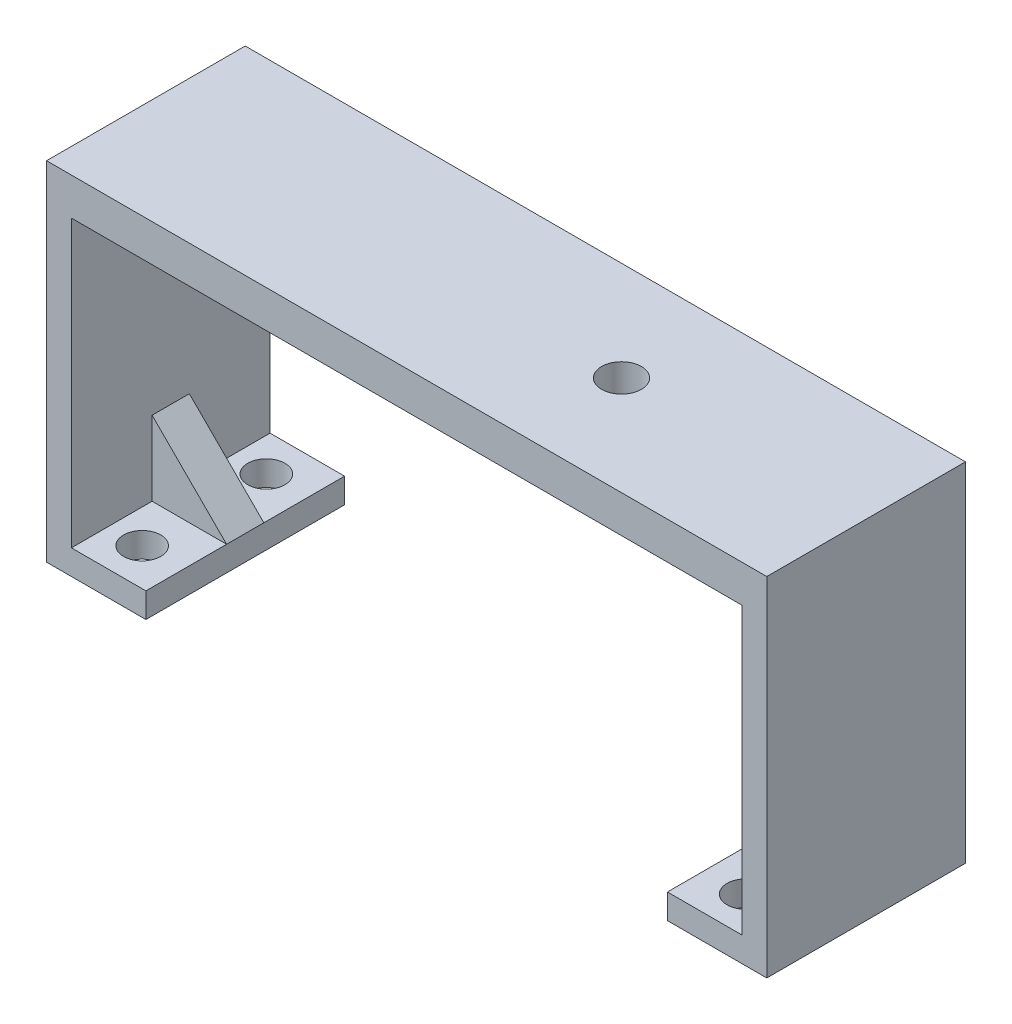
ISO-10303-21;
HEADER;
FILE_DESCRIPTION(('STEP AP214'),'2;1');
FILE_NAME('part.step','',(''),(''),'','','');
FILE_SCHEMA(('AUTOMOTIVE_DESIGN { 1 0 10303 214 1 1 1 1 }'));
ENDSEC;
DATA;
#1=APPLICATION_CONTEXT('core data for automotive mechanical design processes');
#2=APPLICATION_PROTOCOL_DEFINITION('international standard','automotive_design',2000,#1);
#3=PRODUCT_CONTEXT('',#1,'mechanical');
#4=PRODUCT('Part','Part','',(#3));
#5=PRODUCT_RELATED_PRODUCT_CATEGORY('part','',(#4));
#6=PRODUCT_DEFINITION_FORMATION('','',#4);
#7=PRODUCT_DEFINITION_CONTEXT('part definition',#1,'design');
#8=PRODUCT_DEFINITION('design','',#6,#7);
#9=PRODUCT_DEFINITION_SHAPE('','',#8);
#10=(LENGTH_UNIT() NAMED_UNIT(*) SI_UNIT(.MILLI.,.METRE.));
#11=(NAMED_UNIT(*) PLANE_ANGLE_UNIT() SI_UNIT($,.RADIAN.));
#12=(NAMED_UNIT(*) SI_UNIT($,.STERADIAN.) SOLID_ANGLE_UNIT());
#13=UNCERTAINTY_MEASURE_WITH_UNIT(LENGTH_MEASURE(1.E-05),#10,'distance_accuracy_value','');
#14=(GEOMETRIC_REPRESENTATION_CONTEXT(3) GLOBAL_UNCERTAINTY_ASSIGNED_CONTEXT((#13)) GLOBAL_UNIT_ASSIGNED_CONTEXT((#10,
#11,#12)) REPRESENTATION_CONTEXT('',''));
#15=CARTESIAN_POINT('',(0.,0.,0.));
#16=DIRECTION('',(0.,0.,1.));
#17=DIRECTION('',(1.,0.,0.));
#18=AXIS2_PLACEMENT_3D('',#15,#16,#17);
#19=CARTESIAN_POINT('',(27.,2.,8.));
#20=DIRECTION('',(0.,-1.,0.));
#21=DIRECTION('',(0.,0.,-1.));
#22=AXIS2_PLACEMENT_3D('',#19,#20,#21);
#23=PLANE('',#22);
#24=CARTESIAN_POINT('',(24.3,2.,-5.));
#25=DIRECTION('',(0.,-1.,0.));
#26=DIRECTION('',(0.,0.,-1.));
#27=AXIS2_PLACEMENT_3D('',#24,#25,#26);
#28=CIRCLE('',#27,1.5);
#29=CARTESIAN_POINT('',(24.3,2.,-6.5));
#30=VERTEX_POINT('',#29);
#31=EDGE_CURVE('E365',#30,#30,#28,.T.);
#32=ORIENTED_EDGE('',*,*,#31,.T.);
#33=EDGE_LOOP('',(#32));
#34=FACE_BOUND('',#33,.T.);
#35=DIRECTION('',(1.,0.,0.));
#36=VECTOR('',#35,1.);
#37=CARTESIAN_POINT('',(21.,2.,-1.5));
#38=LINE('',#37,#36);
#39=CARTESIAN_POINT('',(21.,2.,-1.5));
#40=VERTEX_POINT('',#39);
#41=CARTESIAN_POINT('',(27.,2.,-1.5));
#42=VERTEX_POINT('',#41);
#43=EDGE_CURVE('E332',#40,#42,#38,.T.);
#44=ORIENTED_EDGE('',*,*,#43,.T.);
#45=DIRECTION('',(0.,0.,-1.));
#46=VECTOR('',#45,1.);
#47=CARTESIAN_POINT('',(27.,2.,8.));
#48=LINE('',#47,#46);
#49=CARTESIAN_POINT('',(27.,2.,-8.));
#50=VERTEX_POINT('',#49);
#51=EDGE_CURVE('E188',#42,#50,#48,.T.);
#52=ORIENTED_EDGE('',*,*,#51,.T.);
#53=DIRECTION('',(-1.,0.,0.));
#54=VECTOR('',#53,1.);
#55=CARTESIAN_POINT('',(27.,2.,-8.));
#56=LINE('',#55,#54);
#57=CARTESIAN_POINT('',(21.,2.,-8.));
#58=VERTEX_POINT('',#57);
#59=EDGE_CURVE('E237',#50,#58,#56,.T.);
#60=ORIENTED_EDGE('',*,*,#59,.T.);
#61=DIRECTION('',(0.,0.,-1.));
#62=VECTOR('',#61,1.);
#63=CARTESIAN_POINT('',(21.,2.,8.));
#64=LINE('',#63,#62);
#65=EDGE_CURVE('E189',#40,#58,#64,.T.);
#66=ORIENTED_EDGE('',*,*,#65,.F.);
#67=EDGE_LOOP('',(#44,#52,#60,#66));
#68=FACE_BOUND('',#67,.T.);
#69=ADVANCED_FACE('F33',(#34,#68),#23,.F.);
#70=CARTESIAN_POINT('',(-27.,2.,8.));
#71=DIRECTION('',(0.,-1.,0.));
#72=DIRECTION('',(0.,0.,-1.));
#73=AXIS2_PLACEMENT_3D('',#70,#71,#72);
#74=PLANE('',#73);
#75=CARTESIAN_POINT('',(-24.3,2.,5.));
#76=DIRECTION('',(0.,-1.,0.));
#77=DIRECTION('',(0.,0.,-1.));
#78=AXIS2_PLACEMENT_3D('',#75,#76,#77);
#79=CIRCLE('',#78,1.5);
#80=CARTESIAN_POINT('',(-24.3,2.,3.5));
#81=VERTEX_POINT('',#80);
#82=EDGE_CURVE('E357',#81,#81,#79,.T.);
#83=ORIENTED_EDGE('',*,*,#82,.T.);
#84=EDGE_LOOP('',(#83));
#85=FACE_BOUND('',#84,.T.);
#86=DIRECTION('',(1.,0.,0.));
#87=VECTOR('',#86,1.);
#88=CARTESIAN_POINT('',(-27.,2.,1.5));
#89=LINE('',#88,#87);
#90=CARTESIAN_POINT('',(-27.,2.,1.5));
#91=VERTEX_POINT('',#90);
#92=CARTESIAN_POINT('',(-21.,2.,1.5));
#93=VERTEX_POINT('',#92);
#94=EDGE_CURVE('E337',#91,#93,#89,.T.);
#95=ORIENTED_EDGE('',*,*,#94,.F.);
#96=DIRECTION('',(0.,0.,-1.));
#97=VECTOR('',#96,1.);
#98=CARTESIAN_POINT('',(-27.,2.,8.));
#99=LINE('',#98,#97);
#100=CARTESIAN_POINT('',(-27.,2.,8.));
#101=VERTEX_POINT('',#100);
#102=EDGE_CURVE('E202',#101,#91,#99,.T.);
#103=ORIENTED_EDGE('',*,*,#102,.F.);
#104=DIRECTION('',(-1.,0.,0.));
#105=VECTOR('',#104,1.);
#106=CARTESIAN_POINT('',(-27.,2.,8.));
#107=LINE('',#106,#105);
#108=CARTESIAN_POINT('',(-21.,2.,8.));
#109=VERTEX_POINT('',#108);
#110=EDGE_CURVE('E311',#109,#101,#107,.T.);
#111=ORIENTED_EDGE('',*,*,#110,.F.);
#112=DIRECTION('',(0.,0.,-1.));
#113=VECTOR('',#112,1.);
#114=CARTESIAN_POINT('',(-21.,2.,8.));
#115=LINE('',#114,#113);
#116=EDGE_CURVE('E11',#109,#93,#115,.T.);
#117=ORIENTED_EDGE('',*,*,#116,.T.);
#118=EDGE_LOOP('',(#95,#103,#111,#117));
#119=FACE_BOUND('',#118,.T.);
#120=ADVANCED_FACE('F389',(#85,#119),#74,.F.);
#121=CARTESIAN_POINT('',(-27.,2.,8.));
#122=DIRECTION('',(-1.,0.,0.));
#123=DIRECTION('',(0.,0.,1.));
#124=AXIS2_PLACEMENT_3D('',#121,#122,#123);
#125=PLANE('',#124);
#126=DIRECTION('',(0.,-1.,0.));
#127=VECTOR('',#126,1.);
#128=CARTESIAN_POINT('',(-27.,7.99999999999994,1.5));
#129=LINE('',#128,#127);
#130=CARTESIAN_POINT('',(-27.,7.99999999999994,1.5));
#131=VERTEX_POINT('',#130);
#132=EDGE_CURVE('E342',#131,#91,#129,.T.);
#133=ORIENTED_EDGE('',*,*,#132,.F.);
#134=DIRECTION('',(0.,0.,-1.));
#135=VECTOR('',#134,1.);
#136=CARTESIAN_POINT('',(-27.,7.99999999999994,1.5));
#137=LINE('',#136,#135);
#138=CARTESIAN_POINT('',(-27.,7.99999999999994,-1.5));
#139=VERTEX_POINT('',#138);
#140=EDGE_CURVE('E344',#131,#139,#137,.T.);
#141=ORIENTED_EDGE('',*,*,#140,.T.);
#142=DIRECTION('',(0.,-1.,0.));
#143=VECTOR('',#142,1.);
#144=CARTESIAN_POINT('',(-27.,7.99999999999994,-1.5));
#145=LINE('',#144,#143);
#146=CARTESIAN_POINT('',(-27.,2.,-1.5));
#147=VERTEX_POINT('',#146);
#148=EDGE_CURVE('E215',#139,#147,#145,.T.);
#149=ORIENTED_EDGE('',*,*,#148,.T.);
#150=CARTESIAN_POINT('',(-27.,2.,-8.));
#151=VERTEX_POINT('',#150);
#152=EDGE_CURVE('E201',#147,#151,#99,.T.);
#153=ORIENTED_EDGE('',*,*,#152,.T.);
#154=DIRECTION('',(0.,1.,0.));
#155=VECTOR('',#154,1.);
#156=CARTESIAN_POINT('',(-27.,2.,-8.));
#157=LINE('',#156,#155);
#158=CARTESIAN_POINT('',(-27.,25.,-8.));
#159=VERTEX_POINT('',#158);
#160=EDGE_CURVE('E213',#151,#159,#157,.T.);
#161=ORIENTED_EDGE('',*,*,#160,.T.);
#162=DIRECTION('',(0.,0.,-1.));
#163=VECTOR('',#162,1.);
#164=CARTESIAN_POINT('',(-27.,25.,8.));
#165=LINE('',#164,#163);
#166=CARTESIAN_POINT('',(-27.,25.,8.));
#167=VERTEX_POINT('',#166);
#168=EDGE_CURVE('E199',#167,#159,#165,.T.);
#169=ORIENTED_EDGE('',*,*,#168,.F.);
#170=DIRECTION('',(0.,1.,0.));
#171=VECTOR('',#170,1.);
#172=CARTESIAN_POINT('',(-27.,2.,8.));
#173=LINE('',#172,#171);
#174=EDGE_CURVE('E313',#101,#167,#173,.T.);
#175=ORIENTED_EDGE('',*,*,#174,.F.);
#176=ORIENTED_EDGE('',*,*,#102,.T.);
#177=EDGE_LOOP('',(#133,#141,#149,#153,#161,#169,#175,#176));
#178=FACE_BOUND('',#177,.T.);
#179=ADVANCED_FACE('F210',(#178),#125,.F.);
#180=CARTESIAN_POINT('',(-21.,2.,8.));
#181=DIRECTION('',(-1.,0.,0.));
#182=DIRECTION('',(0.,0.,1.));
#183=AXIS2_PLACEMENT_3D('',#180,#181,#182);
#184=PLANE('',#183);
#185=DIRECTION('',(0.,1.,0.));
#186=VECTOR('',#185,1.);
#187=CARTESIAN_POINT('',(-21.,2.,-8.));
#188=LINE('',#187,#186);
#189=CARTESIAN_POINT('',(-21.,0.,-8.));
#190=VERTEX_POINT('',#189);
#191=CARTESIAN_POINT('',(-21.,2.,-8.));
#192=VERTEX_POINT('',#191);
#193=EDGE_CURVE('E224',#190,#192,#188,.T.);
#194=ORIENTED_EDGE('',*,*,#193,.T.);
#195=CARTESIAN_POINT('',(-21.,2.,-1.5));
#196=VERTEX_POINT('',#195);
#197=EDGE_CURVE('E41',#196,#192,#115,.T.);
#198=ORIENTED_EDGE('',*,*,#197,.F.);
#199=DIRECTION('',(0.,0.,-1.));
#200=VECTOR('',#199,1.);
#201=CARTESIAN_POINT('',(-21.,2.,1.5));
#202=LINE('',#201,#200);
#203=EDGE_CURVE('E350',#93,#196,#202,.T.);
#204=ORIENTED_EDGE('',*,*,#203,.F.);
#205=ORIENTED_EDGE('',*,*,#116,.F.);
#206=DIRECTION('',(0.,1.,0.));
#207=VECTOR('',#206,1.);
#208=CARTESIAN_POINT('',(-21.,2.,8.));
#209=LINE('',#208,#207);
#210=CARTESIAN_POINT('',(-21.,0.,8.));
#211=VERTEX_POINT('',#210);
#212=EDGE_CURVE('E252',#211,#109,#209,.T.);
#213=ORIENTED_EDGE('',*,*,#212,.F.);
#214=DIRECTION('',(0.,0.,-1.));
#215=VECTOR('',#214,1.);
#216=CARTESIAN_POINT('',(-21.,0.,8.));
#217=LINE('',#216,#215);
#218=EDGE_CURVE('E253',#211,#190,#217,.T.);
#219=ORIENTED_EDGE('',*,*,#218,.T.);
#220=EDGE_LOOP('',(#194,#198,#204,#205,#213,#219));
#221=FACE_BOUND('',#220,.T.);
#222=ADVANCED_FACE('F35',(#221),#184,.F.);
#223=CARTESIAN_POINT('',(-24.3,2.,-5.));
#224=DIRECTION('',(0.,-1.,0.));
#225=DIRECTION('',(0.,0.,-1.));
#226=AXIS2_PLACEMENT_3D('',#223,#224,#225);
#227=CIRCLE('',#226,1.5);
#228=CARTESIAN_POINT('',(-24.3,2.,-6.5));
#229=VERTEX_POINT('',#228);
#230=EDGE_CURVE('E297',#229,#229,#227,.T.);
#231=ORIENTED_EDGE('',*,*,#230,.T.);
#232=EDGE_LOOP('',(#231));
#233=FACE_BOUND('',#232,.T.);
#234=ORIENTED_EDGE('',*,*,#152,.F.);
#235=DIRECTION('',(1.,0.,0.));
#236=VECTOR('',#235,1.);
#237=CARTESIAN_POINT('',(-27.,2.,-1.5));
#238=LINE('',#237,#236);
#239=EDGE_CURVE('E56',#147,#196,#238,.T.);
#240=ORIENTED_EDGE('',*,*,#239,.T.);
#241=ORIENTED_EDGE('',*,*,#197,.T.);
#242=DIRECTION('',(-1.,0.,0.));
#243=VECTOR('',#242,1.);
#244=CARTESIAN_POINT('',(-27.,2.,-8.));
#245=LINE('',#244,#243);
#246=EDGE_CURVE('E218',#192,#151,#245,.T.);
#247=ORIENTED_EDGE('',*,*,#246,.T.);
#248=EDGE_LOOP('',(#234,#240,#241,#247));
#249=FACE_BOUND('',#248,.T.);
#250=ADVANCED_FACE('F219',(#233,#249),#74,.F.);
#251=CARTESIAN_POINT('',(-27.,25.,8.));
#252=DIRECTION('',(0.,1.,0.));
#253=DIRECTION('',(0.,0.,1.));
#254=AXIS2_PLACEMENT_3D('',#251,#252,#253);
#255=PLANE('',#254);
#256=CARTESIAN_POINT('',(9.3,25.,0.));
#257=DIRECTION('',(0.,1.,0.));
#258=DIRECTION('',(0.,0.,1.));
#259=AXIS2_PLACEMENT_3D('',#256,#257,#258);
#260=CIRCLE('',#259,1.6);
#261=CARTESIAN_POINT('',(9.3,25.,1.6));
#262=VERTEX_POINT('',#261);
#263=EDGE_CURVE('E333',#262,#262,#260,.T.);
#264=ORIENTED_EDGE('',*,*,#263,.T.);
#265=EDGE_LOOP('',(#264));
#266=FACE_BOUND('',#265,.T.);
#267=DIRECTION('',(1.,0.,0.));
#268=VECTOR('',#267,1.);
#269=CARTESIAN_POINT('',(-27.,25.,-8.));
#270=LINE('',#269,#268);
#271=CARTESIAN_POINT('',(27.,25.,-8.));
#272=VERTEX_POINT('',#271);
#273=EDGE_CURVE('E229',#159,#272,#270,.T.);
#274=ORIENTED_EDGE('',*,*,#273,.T.);
#275=DIRECTION('',(0.,0.,-1.));
#276=VECTOR('',#275,1.);
#277=CARTESIAN_POINT('',(27.,25.,8.));
#278=LINE('',#277,#276);
#279=CARTESIAN_POINT('',(27.,25.,8.));
#280=VERTEX_POINT('',#279);
#281=EDGE_CURVE('E196',#280,#272,#278,.T.);
#282=ORIENTED_EDGE('',*,*,#281,.F.);
#283=DIRECTION('',(1.,0.,0.));
#284=VECTOR('',#283,1.);
#285=CARTESIAN_POINT('',(-27.,25.,8.));
#286=LINE('',#285,#284);
#287=EDGE_CURVE('E315',#167,#280,#286,.T.);
#288=ORIENTED_EDGE('',*,*,#287,.F.);
#289=ORIENTED_EDGE('',*,*,#168,.T.);
#290=EDGE_LOOP('',(#274,#282,#288,#289));
#291=FACE_BOUND('',#290,.T.);
#292=ADVANCED_FACE('F404',(#266,#291),#255,.F.);
#293=CARTESIAN_POINT('',(27.,2.,8.));
#294=DIRECTION('',(1.,0.,0.));
#295=DIRECTION('',(0.,0.,-1.));
#296=AXIS2_PLACEMENT_3D('',#293,#294,#295);
#297=PLANE('',#296);
#298=DIRECTION('',(0.,0.,-1.));
#299=VECTOR('',#298,1.);
#300=CARTESIAN_POINT('',(27.,8.,1.5));
#301=LINE('',#300,#299);
#302=CARTESIAN_POINT('',(27.,8.,1.5));
#303=VERTEX_POINT('',#302);
#304=CARTESIAN_POINT('',(27.,8.,-1.5));
#305=VERTEX_POINT('',#304);
#306=EDGE_CURVE('E173',#303,#305,#301,.T.);
#307=ORIENTED_EDGE('',*,*,#306,.F.);
#308=DIRECTION('',(0.,1.,0.));
#309=VECTOR('',#308,1.);
#310=CARTESIAN_POINT('',(27.,2.,1.5));
#311=LINE('',#310,#309);
#312=CARTESIAN_POINT('',(27.,2.,1.5));
#313=VERTEX_POINT('',#312);
#314=EDGE_CURVE('E164',#313,#303,#311,.T.);
#315=ORIENTED_EDGE('',*,*,#314,.F.);
#316=CARTESIAN_POINT('',(27.,2.,8.));
#317=VERTEX_POINT('',#316);
#318=EDGE_CURVE('E183',#317,#313,#48,.T.);
#319=ORIENTED_EDGE('',*,*,#318,.F.);
#320=DIRECTION('',(0.,-1.,0.));
#321=VECTOR('',#320,1.);
#322=CARTESIAN_POINT('',(27.,2.,8.));
#323=LINE('',#322,#321);
#324=EDGE_CURVE('E317',#280,#317,#323,.T.);
#325=ORIENTED_EDGE('',*,*,#324,.F.);
#326=ORIENTED_EDGE('',*,*,#281,.T.);
#327=DIRECTION('',(0.,-1.,0.));
#328=VECTOR('',#327,1.);
#329=CARTESIAN_POINT('',(27.,2.,-8.));
#330=LINE('',#329,#328);
#331=EDGE_CURVE('E231',#272,#50,#330,.T.);
#332=ORIENTED_EDGE('',*,*,#331,.T.);
#333=ORIENTED_EDGE('',*,*,#51,.F.);
#334=DIRECTION('',(0.,1.,0.));
#335=VECTOR('',#334,1.);
#336=CARTESIAN_POINT('',(27.,2.,-1.5));
#337=LINE('',#336,#335);
#338=EDGE_CURVE('E166',#42,#305,#337,.T.);
#339=ORIENTED_EDGE('',*,*,#338,.T.);
#340=EDGE_LOOP('',(#307,#315,#319,#325,#326,#332,#333,#339));
#341=FACE_BOUND('',#340,.T.);
#342=ADVANCED_FACE('F326',(#341),#297,.F.);
#343=CARTESIAN_POINT('',(24.3,2.,5.));
#344=DIRECTION('',(0.,-1.,0.));
#345=DIRECTION('',(0.,0.,-1.));
#346=AXIS2_PLACEMENT_3D('',#343,#344,#345);
#347=CIRCLE('',#346,1.5);
#348=CARTESIAN_POINT('',(24.3,2.,3.5));
#349=VERTEX_POINT('',#348);
#350=EDGE_CURVE('E305',#349,#349,#347,.T.);
#351=ORIENTED_EDGE('',*,*,#350,.T.);
#352=EDGE_LOOP('',(#351));
#353=FACE_BOUND('',#352,.T.);
#354=ORIENTED_EDGE('',*,*,#318,.T.);
#355=DIRECTION('',(1.,0.,0.));
#356=VECTOR('',#355,1.);
#357=CARTESIAN_POINT('',(21.,2.,1.5));
#358=LINE('',#357,#356);
#359=CARTESIAN_POINT('',(21.,2.,1.5));
#360=VERTEX_POINT('',#359);
#361=EDGE_CURVE('E162',#360,#313,#358,.T.);
#362=ORIENTED_EDGE('',*,*,#361,.F.);
#363=CARTESIAN_POINT('',(21.,2.,8.));
#364=VERTEX_POINT('',#363);
#365=EDGE_CURVE('E180',#364,#360,#64,.T.);
#366=ORIENTED_EDGE('',*,*,#365,.F.);
#367=DIRECTION('',(-1.,0.,0.));
#368=VECTOR('',#367,1.);
#369=CARTESIAN_POINT('',(27.,2.,8.));
#370=LINE('',#369,#368);
#371=EDGE_CURVE('E319',#317,#364,#370,.T.);
#372=ORIENTED_EDGE('',*,*,#371,.F.);
#373=EDGE_LOOP('',(#354,#362,#366,#372));
#374=FACE_BOUND('',#373,.T.);
#375=ADVANCED_FACE('F178',(#353,#374),#23,.F.);
#376=CARTESIAN_POINT('',(21.,2.,8.));
#377=DIRECTION('',(1.,0.,0.));
#378=DIRECTION('',(0.,0.,-1.));
#379=AXIS2_PLACEMENT_3D('',#376,#377,#378);
#380=PLANE('',#379);
#381=DIRECTION('',(0.,-1.,0.));
#382=VECTOR('',#381,1.);
#383=CARTESIAN_POINT('',(21.,2.,-8.));
#384=LINE('',#383,#382);
#385=CARTESIAN_POINT('',(21.,0.,-8.));
#386=VERTEX_POINT('',#385);
#387=EDGE_CURVE('E240',#58,#386,#384,.T.);
#388=ORIENTED_EDGE('',*,*,#387,.T.);
#389=DIRECTION('',(0.,0.,-1.));
#390=VECTOR('',#389,1.);
#391=CARTESIAN_POINT('',(21.,0.,8.));
#392=LINE('',#391,#390);
#393=CARTESIAN_POINT('',(21.,0.,8.));
#394=VERTEX_POINT('',#393);
#395=EDGE_CURVE('E192',#394,#386,#392,.T.);
#396=ORIENTED_EDGE('',*,*,#395,.F.);
#397=DIRECTION('',(0.,-1.,0.));
#398=VECTOR('',#397,1.);
#399=CARTESIAN_POINT('',(21.,2.,8.));
#400=LINE('',#399,#398);
#401=EDGE_CURVE('E187',#364,#394,#400,.T.);
#402=ORIENTED_EDGE('',*,*,#401,.F.);
#403=ORIENTED_EDGE('',*,*,#365,.T.);
#404=DIRECTION('',(0.,0.,-1.));
#405=VECTOR('',#404,1.);
#406=CARTESIAN_POINT('',(21.,2.,1.5));
#407=LINE('',#406,#405);
#408=EDGE_CURVE('E169',#360,#40,#407,.T.);
#409=ORIENTED_EDGE('',*,*,#408,.T.);
#410=ORIENTED_EDGE('',*,*,#65,.T.);
#411=EDGE_LOOP('',(#388,#396,#402,#403,#409,#410));
#412=FACE_BOUND('',#411,.T.);
#413=ADVANCED_FACE('F185',(#412),#380,.F.);
#414=CARTESIAN_POINT('',(21.,0.,8.));
#415=DIRECTION('',(0.,1.,0.));
#416=DIRECTION('',(0.,0.,1.));
#417=AXIS2_PLACEMENT_3D('',#414,#415,#416);
#418=PLANE('',#417);
#419=CARTESIAN_POINT('',(24.3,0.,5.));
#420=DIRECTION('',(0.,-1.,0.));
#421=DIRECTION('',(0.,0.,1.));
#422=AXIS2_PLACEMENT_3D('',#419,#420,#421);
#423=CIRCLE('',#422,1.5);
#424=CARTESIAN_POINT('',(24.3,0.,6.5));
#425=VERTEX_POINT('',#424);
#426=EDGE_CURVE('E358',#425,#425,#423,.T.);
#427=ORIENTED_EDGE('',*,*,#426,.F.);
#428=EDGE_LOOP('',(#427));
#429=FACE_BOUND('',#428,.T.);
#430=CARTESIAN_POINT('',(24.3,0.,-5.));
#431=DIRECTION('',(0.,-1.,0.));
#432=DIRECTION('',(0.,0.,1.));
#433=AXIS2_PLACEMENT_3D('',#430,#431,#432);
#434=CIRCLE('',#433,1.5);
#435=CARTESIAN_POINT('',(24.3,0.,-3.5));
#436=VERTEX_POINT('',#435);
#437=EDGE_CURVE('E353',#436,#436,#434,.T.);
#438=ORIENTED_EDGE('',*,*,#437,.F.);
#439=EDGE_LOOP('',(#438));
#440=FACE_BOUND('',#439,.T.);
#441=DIRECTION('',(1.,0.,0.));
#442=VECTOR('',#441,1.);
#443=CARTESIAN_POINT('',(21.,0.,-8.));
#444=LINE('',#443,#442);
#445=CARTESIAN_POINT('',(29.,0.,-8.));
#446=VERTEX_POINT('',#445);
#447=EDGE_CURVE('E242',#386,#446,#444,.T.);
#448=ORIENTED_EDGE('',*,*,#447,.T.);
#449=DIRECTION('',(0.,0.,-1.));
#450=VECTOR('',#449,1.);
#451=CARTESIAN_POINT('',(29.,0.,8.));
#452=LINE('',#451,#450);
#453=CARTESIAN_POINT('',(29.,0.,8.));
#454=VERTEX_POINT('',#453);
#455=EDGE_CURVE('E265',#454,#446,#452,.T.);
#456=ORIENTED_EDGE('',*,*,#455,.F.);
#457=DIRECTION('',(1.,0.,0.));
#458=VECTOR('',#457,1.);
#459=CARTESIAN_POINT('',(21.,0.,8.));
#460=LINE('',#459,#458);
#461=EDGE_CURVE('E276',#394,#454,#460,.T.);
#462=ORIENTED_EDGE('',*,*,#461,.F.);
#463=ORIENTED_EDGE('',*,*,#395,.T.);
#464=EDGE_LOOP('',(#448,#456,#462,#463));
#465=FACE_BOUND('',#464,.T.);
#466=ADVANCED_FACE('F275',(#429,#440,#465),#418,.F.);
#467=CARTESIAN_POINT('',(29.,28.,8.));
#468=DIRECTION('',(-1.,0.,0.));
#469=DIRECTION('',(0.,-1.,0.));
#470=AXIS2_PLACEMENT_3D('',#467,#468,#469);
#471=PLANE('',#470);
#472=DIRECTION('',(0.,1.,0.));
#473=VECTOR('',#472,1.);
#474=CARTESIAN_POINT('',(29.,28.,-8.));
#475=LINE('',#474,#473);
#476=CARTESIAN_POINT('',(29.,28.,-8.));
#477=VERTEX_POINT('',#476);
#478=EDGE_CURVE('E244',#446,#477,#475,.T.);
#479=ORIENTED_EDGE('',*,*,#478,.T.);
#480=DIRECTION('',(0.,0.,-1.));
#481=VECTOR('',#480,1.);
#482=CARTESIAN_POINT('',(29.,28.,8.));
#483=LINE('',#482,#481);
#484=CARTESIAN_POINT('',(29.,28.,8.));
#485=VERTEX_POINT('',#484);
#486=EDGE_CURVE('E263',#485,#477,#483,.T.);
#487=ORIENTED_EDGE('',*,*,#486,.F.);
#488=DIRECTION('',(0.,1.,0.));
#489=VECTOR('',#488,1.);
#490=CARTESIAN_POINT('',(29.,28.,8.));
#491=LINE('',#490,#489);
#492=EDGE_CURVE('E291',#454,#485,#491,.T.);
#493=ORIENTED_EDGE('',*,*,#492,.F.);
#494=ORIENTED_EDGE('',*,*,#455,.T.);
#495=EDGE_LOOP('',(#479,#487,#493,#494));
#496=FACE_BOUND('',#495,.T.);
#497=ADVANCED_FACE('F282',(#496),#471,.F.);
#498=CARTESIAN_POINT('',(29.,28.,8.));
#499=DIRECTION('',(0.,-1.,0.));
#500=DIRECTION('',(0.,0.,-1.));
#501=AXIS2_PLACEMENT_3D('',#498,#499,#500);
#502=PLANE('',#501);
#503=CARTESIAN_POINT('',(9.3,28.,0.));
#504=DIRECTION('',(0.,1.,0.));
#505=DIRECTION('',(0.,0.,1.));
#506=AXIS2_PLACEMENT_3D('',#503,#504,#505);
#507=CIRCLE('',#506,1.6);
#508=CARTESIAN_POINT('',(9.3,28.,1.6));
#509=VERTEX_POINT('',#508);
#510=EDGE_CURVE('E628',#509,#509,#507,.T.);
#511=ORIENTED_EDGE('',*,*,#510,.F.);
#512=EDGE_LOOP('',(#511));
#513=FACE_BOUND('',#512,.T.);
#514=DIRECTION('',(-1.,0.,0.));
#515=VECTOR('',#514,1.);
#516=CARTESIAN_POINT('',(29.,28.,-8.));
#517=LINE('',#516,#515);
#518=CARTESIAN_POINT('',(-29.,28.,-8.));
#519=VERTEX_POINT('',#518);
#520=EDGE_CURVE('E246',#477,#519,#517,.T.);
#521=ORIENTED_EDGE('',*,*,#520,.T.);
#522=DIRECTION('',(0.,0.,-1.));
#523=VECTOR('',#522,1.);
#524=CARTESIAN_POINT('',(-29.,28.,8.));
#525=LINE('',#524,#523);
#526=CARTESIAN_POINT('',(-29.,28.,8.));
#527=VERTEX_POINT('',#526);
#528=EDGE_CURVE('E260',#527,#519,#525,.T.);
#529=ORIENTED_EDGE('',*,*,#528,.F.);
#530=DIRECTION('',(-1.,0.,0.));
#531=VECTOR('',#530,1.);
#532=CARTESIAN_POINT('',(29.,28.,8.));
#533=LINE('',#532,#531);
#534=EDGE_CURVE('E287',#485,#527,#533,.T.);
#535=ORIENTED_EDGE('',*,*,#534,.F.);
#536=ORIENTED_EDGE('',*,*,#486,.T.);
#537=EDGE_LOOP('',(#521,#529,#535,#536));
#538=FACE_BOUND('',#537,.T.);
#539=ADVANCED_FACE('F285',(#513,#538),#502,.F.);
#540=CARTESIAN_POINT('',(-29.,28.,8.));
#541=DIRECTION('',(1.,0.,0.));
#542=DIRECTION('',(0.,1.,0.));
#543=AXIS2_PLACEMENT_3D('',#540,#541,#542);
#544=PLANE('',#543);
#545=DIRECTION('',(0.,-1.,0.));
#546=VECTOR('',#545,1.);
#547=CARTESIAN_POINT('',(-29.,28.,-8.));
#548=LINE('',#547,#546);
#549=CARTESIAN_POINT('',(-29.,0.,-8.));
#550=VERTEX_POINT('',#549);
#551=EDGE_CURVE('E248',#519,#550,#548,.T.);
#552=ORIENTED_EDGE('',*,*,#551,.T.);
#553=DIRECTION('',(0.,0.,-1.));
#554=VECTOR('',#553,1.);
#555=CARTESIAN_POINT('',(-29.,0.,8.));
#556=LINE('',#555,#554);
#557=CARTESIAN_POINT('',(-29.,0.,8.));
#558=VERTEX_POINT('',#557);
#559=EDGE_CURVE('E256',#558,#550,#556,.T.);
#560=ORIENTED_EDGE('',*,*,#559,.F.);
#561=DIRECTION('',(0.,-1.,0.));
#562=VECTOR('',#561,1.);
#563=CARTESIAN_POINT('',(-29.,28.,8.));
#564=LINE('',#563,#562);
#565=EDGE_CURVE('E290',#527,#558,#564,.T.);
#566=ORIENTED_EDGE('',*,*,#565,.F.);
#567=ORIENTED_EDGE('',*,*,#528,.T.);
#568=EDGE_LOOP('',(#552,#560,#566,#567));
#569=FACE_BOUND('',#568,.T.);
#570=ADVANCED_FACE('F471',(#569),#544,.F.);
#571=CARTESIAN_POINT('',(-21.,0.,8.));
#572=DIRECTION('',(0.,1.,0.));
#573=DIRECTION('',(0.,0.,1.));
#574=AXIS2_PLACEMENT_3D('',#571,#572,#573);
#575=PLANE('',#574);
#576=CARTESIAN_POINT('',(-24.3,0.,5.));
#577=DIRECTION('',(0.,-1.,0.));
#578=DIRECTION('',(0.,0.,-1.));
#579=AXIS2_PLACEMENT_3D('',#576,#577,#578);
#580=CIRCLE('',#579,1.5);
#581=CARTESIAN_POINT('',(-24.3,0.,3.5));
#582=VERTEX_POINT('',#581);
#583=EDGE_CURVE('E354',#582,#582,#580,.T.);
#584=ORIENTED_EDGE('',*,*,#583,.F.);
#585=EDGE_LOOP('',(#584));
#586=FACE_BOUND('',#585,.T.);
#587=CARTESIAN_POINT('',(-24.3,0.,-5.));
#588=DIRECTION('',(0.,-1.,0.));
#589=DIRECTION('',(0.,0.,-1.));
#590=AXIS2_PLACEMENT_3D('',#587,#588,#589);
#591=CIRCLE('',#590,1.5);
#592=CARTESIAN_POINT('',(-24.3,0.,-6.5));
#593=VERTEX_POINT('',#592);
#594=EDGE_CURVE('E300',#593,#593,#591,.T.);
#595=ORIENTED_EDGE('',*,*,#594,.F.);
#596=EDGE_LOOP('',(#595));
#597=FACE_BOUND('',#596,.T.);
#598=DIRECTION('',(1.,0.,0.));
#599=VECTOR('',#598,1.);
#600=CARTESIAN_POINT('',(-21.,0.,-8.));
#601=LINE('',#600,#599);
#602=EDGE_CURVE('E250',#550,#190,#601,.T.);
#603=ORIENTED_EDGE('',*,*,#602,.T.);
#604=ORIENTED_EDGE('',*,*,#218,.F.);
#605=DIRECTION('',(1.,0.,0.));
#606=VECTOR('',#605,1.);
#607=CARTESIAN_POINT('',(-21.,0.,8.));
#608=LINE('',#607,#606);
#609=EDGE_CURVE('E257',#558,#211,#608,.T.);
#610=ORIENTED_EDGE('',*,*,#609,.F.);
#611=ORIENTED_EDGE('',*,*,#559,.T.);
#612=EDGE_LOOP('',(#603,#604,#610,#611));
#613=FACE_BOUND('',#612,.T.);
#614=ADVANCED_FACE('F466',(#586,#597,#613),#575,.F.);
#615=CARTESIAN_POINT('',(0.,0.,8.));
#616=DIRECTION('',(0.,0.,-1.));
#617=DIRECTION('',(-1.,0.,0.));
#618=AXIS2_PLACEMENT_3D('',#615,#616,#617);
#619=PLANE('',#618);
#620=ORIENTED_EDGE('',*,*,#212,.T.);
#621=ORIENTED_EDGE('',*,*,#110,.T.);
#622=ORIENTED_EDGE('',*,*,#174,.T.);
#623=ORIENTED_EDGE('',*,*,#287,.T.);
#624=ORIENTED_EDGE('',*,*,#324,.T.);
#625=ORIENTED_EDGE('',*,*,#371,.T.);
#626=ORIENTED_EDGE('',*,*,#401,.T.);
#627=ORIENTED_EDGE('',*,*,#461,.T.);
#628=ORIENTED_EDGE('',*,*,#492,.T.);
#629=ORIENTED_EDGE('',*,*,#534,.T.);
#630=ORIENTED_EDGE('',*,*,#565,.T.);
#631=ORIENTED_EDGE('',*,*,#609,.T.);
#632=EDGE_LOOP('',(#620,#621,#622,#623,#624,#625,#626,#627,#628,#629,#630,#631));
#633=FACE_BOUND('',#632,.T.);
#634=ADVANCED_FACE('F321',(#633),#619,.F.);
#635=CARTESIAN_POINT('',(0.,0.,-8.));
#636=DIRECTION('',(0.,0.,-1.));
#637=DIRECTION('',(-1.,0.,0.));
#638=AXIS2_PLACEMENT_3D('',#635,#636,#637);
#639=PLANE('',#638);
#640=ORIENTED_EDGE('',*,*,#193,.F.);
#641=ORIENTED_EDGE('',*,*,#602,.F.);
#642=ORIENTED_EDGE('',*,*,#551,.F.);
#643=ORIENTED_EDGE('',*,*,#520,.F.);
#644=ORIENTED_EDGE('',*,*,#478,.F.);
#645=ORIENTED_EDGE('',*,*,#447,.F.);
#646=ORIENTED_EDGE('',*,*,#387,.F.);
#647=ORIENTED_EDGE('',*,*,#59,.F.);
#648=ORIENTED_EDGE('',*,*,#331,.F.);
#649=ORIENTED_EDGE('',*,*,#273,.F.);
#650=ORIENTED_EDGE('',*,*,#160,.F.);
#651=ORIENTED_EDGE('',*,*,#246,.F.);
#652=EDGE_LOOP('',(#640,#641,#642,#643,#644,#645,#646,#647,#648,#649,#650,#651));
#653=FACE_BOUND('',#652,.T.);
#654=ADVANCED_FACE('F227',(#653),#639,.T.);
#655=CARTESIAN_POINT('',(-24.3,16.,-5.));
#656=DIRECTION('',(0.,-1.,0.));
#657=DIRECTION('',(0.,0.,-1.));
#658=AXIS2_PLACEMENT_3D('',#655,#656,#657);
#659=CYLINDRICAL_SURFACE('',#658,1.5);
#660=ORIENTED_EDGE('',*,*,#594,.T.);
#661=EDGE_LOOP('',(#660));
#662=FACE_BOUND('',#661,.T.);
#663=ORIENTED_EDGE('',*,*,#230,.F.);
#664=EDGE_LOOP('',(#663));
#665=FACE_BOUND('',#664,.T.);
#666=ADVANCED_FACE('F450',(#662,#665),#659,.F.);
#667=CARTESIAN_POINT('',(-24.3,16.,5.));
#668=DIRECTION('',(0.,-1.,0.));
#669=DIRECTION('',(0.,0.,-1.));
#670=AXIS2_PLACEMENT_3D('',#667,#668,#669);
#671=CYLINDRICAL_SURFACE('',#670,1.5);
#672=ORIENTED_EDGE('',*,*,#583,.T.);
#673=EDGE_LOOP('',(#672));
#674=FACE_BOUND('',#673,.T.);
#675=ORIENTED_EDGE('',*,*,#82,.F.);
#676=EDGE_LOOP('',(#675));
#677=FACE_BOUND('',#676,.T.);
#678=ADVANCED_FACE('F384',(#674,#677),#671,.F.);
#679=CARTESIAN_POINT('',(24.3,16.,-5.));
#680=DIRECTION('',(0.,-1.,0.));
#681=DIRECTION('',(0.,0.,-1.));
#682=AXIS2_PLACEMENT_3D('',#679,#680,#681);
#683=CYLINDRICAL_SURFACE('',#682,1.5);
#684=ORIENTED_EDGE('',*,*,#437,.T.);
#685=EDGE_LOOP('',(#684));
#686=FACE_BOUND('',#685,.T.);
#687=ORIENTED_EDGE('',*,*,#31,.F.);
#688=EDGE_LOOP('',(#687));
#689=FACE_BOUND('',#688,.T.);
#690=ADVANCED_FACE('F374',(#686,#689),#683,.F.);
#691=CARTESIAN_POINT('',(24.3,16.,5.));
#692=DIRECTION('',(0.,-1.,0.));
#693=DIRECTION('',(0.,0.,-1.));
#694=AXIS2_PLACEMENT_3D('',#691,#692,#693);
#695=CYLINDRICAL_SURFACE('',#694,1.5);
#696=ORIENTED_EDGE('',*,*,#426,.T.);
#697=EDGE_LOOP('',(#696));
#698=FACE_BOUND('',#697,.T.);
#699=ORIENTED_EDGE('',*,*,#350,.F.);
#700=EDGE_LOOP('',(#699));
#701=FACE_BOUND('',#700,.T.);
#702=ADVANCED_FACE('F371',(#698,#701),#695,.F.);
#703=CARTESIAN_POINT('',(-21.,2.,1.5));
#704=DIRECTION('',(-0.707106781186544,-0.707106781186551,0.));
#705=DIRECTION('',(0.707106781186551,-0.707106781186544,0.));
#706=AXIS2_PLACEMENT_3D('',#703,#704,#705);
#707=PLANE('',#706);
#708=DIRECTION('',(-0.707106781186551,0.707106781186544,0.));
#709=VECTOR('',#708,1.);
#710=CARTESIAN_POINT('',(-21.,2.,-1.5));
#711=LINE('',#710,#709);
#712=EDGE_CURVE('E346',#196,#139,#711,.T.);
#713=ORIENTED_EDGE('',*,*,#712,.T.);
#714=ORIENTED_EDGE('',*,*,#140,.F.);
#715=DIRECTION('',(-0.707106781186551,0.707106781186544,0.));
#716=VECTOR('',#715,1.);
#717=CARTESIAN_POINT('',(-21.,2.,1.5));
#718=LINE('',#717,#716);
#719=EDGE_CURVE('E340',#93,#131,#718,.T.);
#720=ORIENTED_EDGE('',*,*,#719,.F.);
#721=ORIENTED_EDGE('',*,*,#203,.T.);
#722=EDGE_LOOP('',(#713,#714,#720,#721));
#723=FACE_BOUND('',#722,.T.);
#724=ADVANCED_FACE('F373',(#723),#707,.F.);
#725=CARTESIAN_POINT('',(0.,0.,1.5));
#726=DIRECTION('',(0.,0.,-1.));
#727=DIRECTION('',(-1.,0.,0.));
#728=AXIS2_PLACEMENT_3D('',#725,#726,#727);
#729=PLANE('',#728);
#730=ORIENTED_EDGE('',*,*,#94,.T.);
#731=ORIENTED_EDGE('',*,*,#719,.T.);
#732=ORIENTED_EDGE('',*,*,#132,.T.);
#733=EDGE_LOOP('',(#730,#731,#732));
#734=FACE_BOUND('',#733,.T.);
#735=ADVANCED_FACE('F381',(#734),#729,.F.);
#736=CARTESIAN_POINT('',(0.,0.,-1.5));
#737=DIRECTION('',(0.,0.,-1.));
#738=DIRECTION('',(-1.,0.,0.));
#739=AXIS2_PLACEMENT_3D('',#736,#737,#738);
#740=PLANE('',#739);
#741=ORIENTED_EDGE('',*,*,#239,.F.);
#742=ORIENTED_EDGE('',*,*,#148,.F.);
#743=ORIENTED_EDGE('',*,*,#712,.F.);
#744=EDGE_LOOP('',(#741,#742,#743));
#745=FACE_BOUND('',#744,.T.);
#746=ADVANCED_FACE('F557',(#745),#740,.T.);
#747=CARTESIAN_POINT('',(27.,8.,1.5));
#748=DIRECTION('',(0.707106781186548,-0.707106781186548,0.));
#749=DIRECTION('',(0.707106781186548,0.707106781186548,0.));
#750=AXIS2_PLACEMENT_3D('',#747,#748,#749);
#751=PLANE('',#750);
#752=DIRECTION('',(-0.707106781186547,-0.707106781186547,0.));
#753=VECTOR('',#752,1.);
#754=CARTESIAN_POINT('',(27.,8.,-1.5));
#755=LINE('',#754,#753);
#756=EDGE_CURVE('E48',#305,#40,#755,.T.);
#757=ORIENTED_EDGE('',*,*,#756,.T.);
#758=ORIENTED_EDGE('',*,*,#408,.F.);
#759=DIRECTION('',(-0.707106781186547,-0.707106781186547,0.));
#760=VECTOR('',#759,1.);
#761=CARTESIAN_POINT('',(27.,8.,1.5));
#762=LINE('',#761,#760);
#763=EDGE_CURVE('E159',#303,#360,#762,.T.);
#764=ORIENTED_EDGE('',*,*,#763,.F.);
#765=ORIENTED_EDGE('',*,*,#306,.T.);
#766=EDGE_LOOP('',(#757,#758,#764,#765));
#767=FACE_BOUND('',#766,.T.);
#768=ADVANCED_FACE('F170',(#767),#751,.F.);
#769=CARTESIAN_POINT('',(0.,0.,1.5));
#770=DIRECTION('',(0.,0.,1.));
#771=DIRECTION('',(1.,0.,0.));
#772=AXIS2_PLACEMENT_3D('',#769,#770,#771);
#773=PLANE('',#772);
#774=ORIENTED_EDGE('',*,*,#763,.T.);
#775=ORIENTED_EDGE('',*,*,#361,.T.);
#776=ORIENTED_EDGE('',*,*,#314,.T.);
#777=EDGE_LOOP('',(#774,#775,#776));
#778=FACE_BOUND('',#777,.T.);
#779=ADVANCED_FACE('F160',(#778),#773,.T.);
#780=CARTESIAN_POINT('',(0.,0.,-1.5));
#781=DIRECTION('',(0.,0.,1.));
#782=DIRECTION('',(1.,0.,0.));
#783=AXIS2_PLACEMENT_3D('',#780,#781,#782);
#784=PLANE('',#783);
#785=ORIENTED_EDGE('',*,*,#756,.F.);
#786=ORIENTED_EDGE('',*,*,#338,.F.);
#787=ORIENTED_EDGE('',*,*,#43,.F.);
#788=EDGE_LOOP('',(#785,#786,#787));
#789=FACE_BOUND('',#788,.T.);
#790=ADVANCED_FACE('F535',(#789),#784,.F.);
#791=CARTESIAN_POINT('',(9.3,25.,0.));
#792=DIRECTION('',(0.,1.,0.));
#793=DIRECTION('',(0.,0.,1.));
#794=AXIS2_PLACEMENT_3D('',#791,#792,#793);
#795=CYLINDRICAL_SURFACE('',#794,1.6);
#796=ORIENTED_EDGE('',*,*,#263,.F.);
#797=EDGE_LOOP('',(#796));
#798=FACE_BOUND('',#797,.T.);
#799=ORIENTED_EDGE('',*,*,#510,.T.);
#800=EDGE_LOOP('',(#799));
#801=FACE_BOUND('',#800,.T.);
#802=ADVANCED_FACE('F531',(#798,#801),#795,.F.);
#803=CLOSED_SHELL('',(#69,#120,#179,#222,#250,#292,#342,#375,#413,#466,#497,#539,#570,#614,#634,
#654,#666,#678,#690,#702,#724,#735,#746,#768,#779,#790,#802));
#804=MANIFOLD_SOLID_BREP('B2',#803);
#805=ADVANCED_BREP_SHAPE_REPRESENTATION('',(#18,#804),#14);
#806=SHAPE_DEFINITION_REPRESENTATION(#9,#805);
ENDSEC;
END-ISO-10303-21;
